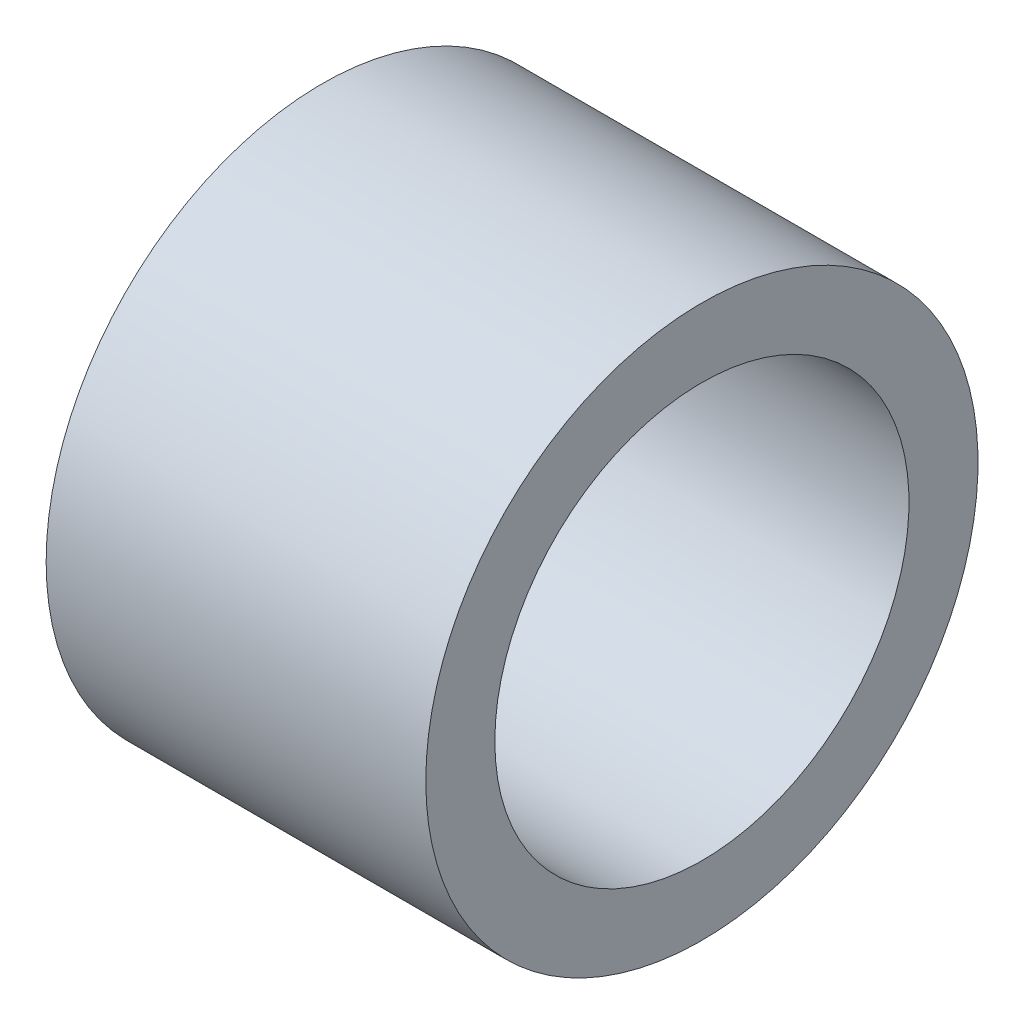
ISO-10303-21;
HEADER;
FILE_DESCRIPTION(('STEP AP214'),'2;1');
FILE_NAME('part.step','',(''),(''),'','','');
FILE_SCHEMA(('AUTOMOTIVE_DESIGN { 1 0 10303 214 1 1 1 1 }'));
ENDSEC;
DATA;
#1=APPLICATION_CONTEXT('core data for automotive mechanical design processes');
#2=APPLICATION_PROTOCOL_DEFINITION('international standard','automotive_design',2000,#1);
#3=PRODUCT_CONTEXT('',#1,'mechanical');
#4=PRODUCT('Part','Part','',(#3));
#5=PRODUCT_RELATED_PRODUCT_CATEGORY('part','',(#4));
#6=PRODUCT_DEFINITION_FORMATION('','',#4);
#7=PRODUCT_DEFINITION_CONTEXT('part definition',#1,'design');
#8=PRODUCT_DEFINITION('design','',#6,#7);
#9=PRODUCT_DEFINITION_SHAPE('','',#8);
#10=(LENGTH_UNIT() NAMED_UNIT(*) SI_UNIT(.MILLI.,.METRE.));
#11=(NAMED_UNIT(*) PLANE_ANGLE_UNIT() SI_UNIT($,.RADIAN.));
#12=(NAMED_UNIT(*) SI_UNIT($,.STERADIAN.) SOLID_ANGLE_UNIT());
#13=UNCERTAINTY_MEASURE_WITH_UNIT(LENGTH_MEASURE(1.E-05),#10,'distance_accuracy_value','');
#14=(GEOMETRIC_REPRESENTATION_CONTEXT(3) GLOBAL_UNCERTAINTY_ASSIGNED_CONTEXT((#13)) GLOBAL_UNIT_ASSIGNED_CONTEXT((#10,
#11,#12)) REPRESENTATION_CONTEXT('',''));
#15=CARTESIAN_POINT('',(0.,0.,0.));
#16=DIRECTION('',(0.,0.,1.));
#17=DIRECTION('',(1.,0.,0.));
#18=AXIS2_PLACEMENT_3D('',#15,#16,#17);
#19=CARTESIAN_POINT('',(0.,3.,0.));
#20=DIRECTION('',(1.,0.,0.));
#21=DIRECTION('',(0.,0.,-1.));
#22=AXIS2_PLACEMENT_3D('',#19,#20,#21);
#23=PLANE('',#22);
#24=CARTESIAN_POINT('',(0.,0.,0.));
#25=DIRECTION('',(-1.,0.,0.));
#26=DIRECTION('',(0.,0.,1.));
#27=AXIS2_PLACEMENT_3D('',#24,#25,#26);
#28=CIRCLE('',#27,3.);
#29=CARTESIAN_POINT('',(0.,0.,3.));
#30=VERTEX_POINT('',#29);
#31=EDGE_CURVE('E59',#30,#30,#28,.T.);
#32=ORIENTED_EDGE('',*,*,#31,.F.);
#33=EDGE_LOOP('',(#32));
#34=FACE_BOUND('',#33,.T.);
#35=CARTESIAN_POINT('',(0.,0.,0.));
#36=DIRECTION('',(-1.,0.,0.));
#37=DIRECTION('',(0.,0.,1.));
#38=AXIS2_PLACEMENT_3D('',#35,#36,#37);
#39=CIRCLE('',#38,4.);
#40=CARTESIAN_POINT('',(0.,0.,4.));
#41=VERTEX_POINT('',#40);
#42=EDGE_CURVE('E10',#41,#41,#39,.T.);
#43=ORIENTED_EDGE('',*,*,#42,.T.);
#44=EDGE_LOOP('',(#43));
#45=FACE_BOUND('',#44,.T.);
#46=ADVANCED_FACE('F40',(#34,#45),#23,.F.);
#47=CARTESIAN_POINT('',(0.,0.,0.));
#48=DIRECTION('',(-1.,0.,0.));
#49=DIRECTION('',(0.,0.,1.));
#50=AXIS2_PLACEMENT_3D('',#47,#48,#49);
#51=CYLINDRICAL_SURFACE('',#50,4.);
#52=ORIENTED_EDGE('',*,*,#42,.F.);
#53=EDGE_LOOP('',(#52));
#54=FACE_BOUND('',#53,.T.);
#55=CARTESIAN_POINT('',(5.5,0.,0.));
#56=DIRECTION('',(-1.,0.,0.));
#57=DIRECTION('',(0.,0.,1.));
#58=AXIS2_PLACEMENT_3D('',#55,#56,#57);
#59=CIRCLE('',#58,4.);
#60=CARTESIAN_POINT('',(5.5,0.,4.));
#61=VERTEX_POINT('',#60);
#62=EDGE_CURVE('E47',#61,#61,#59,.T.);
#63=ORIENTED_EDGE('',*,*,#62,.T.);
#64=EDGE_LOOP('',(#63));
#65=FACE_BOUND('',#64,.T.);
#66=ADVANCED_FACE('F70',(#54,#65),#51,.T.);
#67=CARTESIAN_POINT('',(5.5,3.,0.));
#68=DIRECTION('',(-1.,0.,0.));
#69=DIRECTION('',(0.,0.,1.));
#70=AXIS2_PLACEMENT_3D('',#67,#68,#69);
#71=PLANE('',#70);
#72=ORIENTED_EDGE('',*,*,#62,.F.);
#73=EDGE_LOOP('',(#72));
#74=FACE_BOUND('',#73,.T.);
#75=CARTESIAN_POINT('',(5.5,0.,0.));
#76=DIRECTION('',(-1.,0.,0.));
#77=DIRECTION('',(0.,0.,1.));
#78=AXIS2_PLACEMENT_3D('',#75,#76,#77);
#79=CIRCLE('',#78,3.);
#80=CARTESIAN_POINT('',(5.5,0.,3.));
#81=VERTEX_POINT('',#80);
#82=EDGE_CURVE('E53',#81,#81,#79,.T.);
#83=ORIENTED_EDGE('',*,*,#82,.T.);
#84=EDGE_LOOP('',(#83));
#85=FACE_BOUND('',#84,.T.);
#86=ADVANCED_FACE('F74',(#74,#85),#71,.F.);
#87=CARTESIAN_POINT('',(0.,0.,0.));
#88=DIRECTION('',(-1.,0.,0.));
#89=DIRECTION('',(0.,0.,1.));
#90=AXIS2_PLACEMENT_3D('',#87,#88,#89);
#91=CYLINDRICAL_SURFACE('',#90,3.);
#92=ORIENTED_EDGE('',*,*,#82,.F.);
#93=EDGE_LOOP('',(#92));
#94=FACE_BOUND('',#93,.T.);
#95=ORIENTED_EDGE('',*,*,#31,.T.);
#96=EDGE_LOOP('',(#95));
#97=FACE_BOUND('',#96,.T.);
#98=ADVANCED_FACE('F67',(#94,#97),#91,.F.);
#99=CLOSED_SHELL('',(#46,#66,#86,#98));
#100=MANIFOLD_SOLID_BREP('B2',#99);
#101=ADVANCED_BREP_SHAPE_REPRESENTATION('',(#18,#100),#14);
#102=SHAPE_DEFINITION_REPRESENTATION(#9,#101);
ENDSEC;
END-ISO-10303-21;
